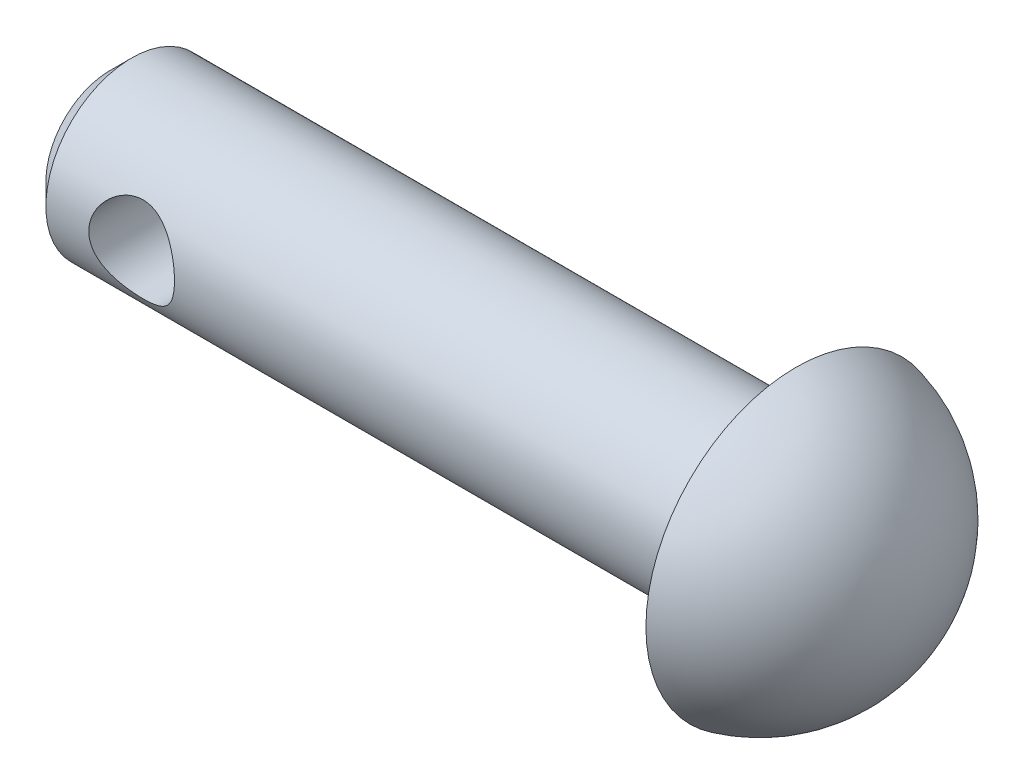
ISO-10303-21;
HEADER;
FILE_DESCRIPTION(('STEP AP214'),'2;1');
FILE_NAME('part.step','',(''),(''),'','','');
FILE_SCHEMA(('AUTOMOTIVE_DESIGN { 1 0 10303 214 1 1 1 1 }'));
ENDSEC;
DATA;
#1=APPLICATION_CONTEXT('core data for automotive mechanical design processes');
#2=APPLICATION_PROTOCOL_DEFINITION('international standard','automotive_design',2000,#1);
#3=PRODUCT_CONTEXT('',#1,'mechanical');
#4=PRODUCT('Part','Part','',(#3));
#5=PRODUCT_RELATED_PRODUCT_CATEGORY('part','',(#4));
#6=PRODUCT_DEFINITION_FORMATION('','',#4);
#7=PRODUCT_DEFINITION_CONTEXT('part definition',#1,'design');
#8=PRODUCT_DEFINITION('design','',#6,#7);
#9=PRODUCT_DEFINITION_SHAPE('','',#8);
#10=(LENGTH_UNIT() NAMED_UNIT(*) SI_UNIT(.MILLI.,.METRE.));
#11=(NAMED_UNIT(*) PLANE_ANGLE_UNIT() SI_UNIT($,.RADIAN.));
#12=(NAMED_UNIT(*) SI_UNIT($,.STERADIAN.) SOLID_ANGLE_UNIT());
#13=UNCERTAINTY_MEASURE_WITH_UNIT(LENGTH_MEASURE(1.E-05),#10,'distance_accuracy_value','');
#14=(GEOMETRIC_REPRESENTATION_CONTEXT(3) GLOBAL_UNCERTAINTY_ASSIGNED_CONTEXT((#13)) GLOBAL_UNIT_ASSIGNED_CONTEXT((#10,
#11,#12)) REPRESENTATION_CONTEXT('',''));
#15=CARTESIAN_POINT('',(0.,0.,0.));
#16=DIRECTION('',(0.,0.,1.));
#17=DIRECTION('',(1.,0.,0.));
#18=AXIS2_PLACEMENT_3D('',#15,#16,#17);
#19=CARTESIAN_POINT('',(-16.,0.,0.));
#20=DIRECTION('',(1.,0.,0.));
#21=DIRECTION('',(0.,0.,-1.));
#22=AXIS2_PLACEMENT_3D('',#19,#20,#21);
#23=CYLINDRICAL_SURFACE('',#22,2.);
#24=CARTESIAN_POINT('',(-15.5,0.,0.));
#25=DIRECTION('',(1.,0.,0.));
#26=DIRECTION('',(0.,0.,-1.));
#27=AXIS2_PLACEMENT_3D('',#24,#25,#26);
#28=CIRCLE('',#27,2.);
#29=CARTESIAN_POINT('',(-15.5,0.,-2.));
#30=VERTEX_POINT('',#29);
#31=EDGE_CURVE('E38',#30,#30,#28,.T.);
#32=ORIENTED_EDGE('',*,*,#31,.T.);
#33=EDGE_LOOP('',(#32));
#34=FACE_BOUND('',#33,.T.);
#35=CARTESIAN_POINT('',(-14.5,0.,-2.));
#36=CARTESIAN_POINT('',(-14.4999966976805,0.0525719629529866,-1.99999713404151));
#37=CARTESIAN_POINT('',(-14.4958299268783,0.105206599698033,-1.99790491019518));
#38=CARTESIAN_POINT('',(-14.4793471196591,0.208920235268425,-1.98974156037396));
#39=CARTESIAN_POINT('',(-14.4670156070024,0.259996086713504,-1.98366287828984));
#40=CARTESIAN_POINT('',(-14.4348061913832,0.358933544880575,-1.96816279403312));
#41=CARTESIAN_POINT('',(-14.414957615752,0.40680680293918,-1.9587543917752));
#42=CARTESIAN_POINT('',(-14.3684293786351,0.498472616806565,-1.93745776515779));
#43=CARTESIAN_POINT('',(-14.3417502557511,0.54226549399005,-1.9255697363353));
#44=CARTESIAN_POINT('',(-14.2804827505147,0.62750781776192,-1.89956258258057));
#45=CARTESIAN_POINT('',(-14.2455135207604,0.668655211122113,-1.88535199127536));
#46=CARTESIAN_POINT('',(-14.169478520753,0.744779444866978,-1.85659970246744));
#47=CARTESIAN_POINT('',(-14.1284081482276,0.779751583106767,-1.84205776209035));
#48=CARTESIAN_POINT('',(-14.0375166504766,0.845252000450279,-1.81298951197347));
#49=CARTESIAN_POINT('',(-13.9872639016541,0.875225335551638,-1.79855186970132));
#50=CARTESIAN_POINT('',(-13.8816326640138,0.926168226890696,-1.7728597877232));
#51=CARTESIAN_POINT('',(-13.8262578712773,0.947144214966335,-1.7616030760699));
#52=CARTESIAN_POINT('',(-13.7153348945781,0.97813244218859,-1.74457867037808));
#53=CARTESIAN_POINT('',(-13.6599955479326,0.988725857080443,-1.73852271583713));
#54=CARTESIAN_POINT('',(-13.5480211622205,1.00042699330885,-1.73181889948528));
#55=CARTESIAN_POINT('',(-13.4913874591288,1.00154408837308,-1.73116569343288));
#56=CARTESIAN_POINT('',(-13.3857139756846,0.994687287172296,-1.73510930257248));
#57=CARTESIAN_POINT('',(-13.336575968777,0.987784559536823,-1.73908763662013));
#58=CARTESIAN_POINT('',(-13.240278090627,0.966939849056934,-1.7507622873385));
#59=CARTESIAN_POINT('',(-13.1931188546947,0.952995623897653,-1.75845978831776));
#60=CARTESIAN_POINT('',(-13.1007708674343,0.918209780386005,-1.77687476412741));
#61=CARTESIAN_POINT('',(-13.0556536012142,0.897215067115995,-1.78765840663999));
#62=CARTESIAN_POINT('',(-12.96936570741,0.849041687668003,-1.81103404281404));
#63=CARTESIAN_POINT('',(-12.9281968643999,0.821860243812468,-1.82362684780191));
#64=CARTESIAN_POINT('',(-12.8454787472568,0.75806605491279,-1.85113157903286));
#65=CARTESIAN_POINT('',(-12.8045431264238,0.720694458369282,-1.86613510236746));
#66=CARTESIAN_POINT('',(-12.7292645814091,0.639555578741375,-1.89547623300407));
#67=CARTESIAN_POINT('',(-12.6949248079661,0.595785256574287,-1.90981351958801));
#68=CARTESIAN_POINT('',(-12.6323143389703,0.50051650583185,-1.93701987282964));
#69=CARTESIAN_POINT('',(-12.6043995275543,0.44875359159941,-1.94978984162007));
#70=CARTESIAN_POINT('',(-12.557902970957,0.340466215488798,-1.97157881121242));
#71=CARTESIAN_POINT('',(-12.5393138149848,0.283945576265278,-1.98060078943553));
#72=CARTESIAN_POINT('',(-12.5135245962833,0.172766491660703,-1.99324333741436));
#73=CARTESIAN_POINT('',(-12.5055087642532,0.118341530548325,-1.99724938301312));
#74=CARTESIAN_POINT('',(-12.4985352688655,0.00877959994935463,-2.00073013459102));
#75=CARTESIAN_POINT('',(-12.4995733143605,-0.0463570198699006,-2.00020698721312));
#76=CARTESIAN_POINT('',(-12.5102066884188,-0.151232971985993,-1.99491192253441));
#77=CARTESIAN_POINT('',(-12.51913253273,-0.201059408049954,-1.9904724568819));
#78=CARTESIAN_POINT('',(-12.5442380718951,-0.298406892301917,-1.97822171314819));
#79=CARTESIAN_POINT('',(-12.5604185664534,-0.345927685690997,-1.97041006334332));
#80=CARTESIAN_POINT('',(-12.5999984664332,-0.438888608449665,-1.95184251413669));
#81=CARTESIAN_POINT('',(-12.6235910501168,-0.484230397006154,-1.94100881769939));
#82=CARTESIAN_POINT('',(-12.677107535646,-0.570461361698921,-1.91743974317109));
#83=CARTESIAN_POINT('',(-12.7070341345934,-0.611348629775282,-1.90470355565785));
#84=CARTESIAN_POINT('',(-12.7757604253329,-0.691767689290653,-1.87708221337464));
#85=CARTESIAN_POINT('',(-12.8151428684536,-0.730772077824639,-1.86210884848441));
#86=CARTESIAN_POINT('',(-12.8999251512693,-0.80185632111324,-1.83262391603874));
#87=CARTESIAN_POINT('',(-12.9453291188164,-0.833931385690841,-1.81811267381526));
#88=CARTESIAN_POINT('',(-13.0436436542003,-0.891707914497696,-1.79051192226068));
#89=CARTESIAN_POINT('',(-13.0968112662086,-0.917025495878638,-1.77752529663472));
#90=CARTESIAN_POINT('',(-13.2075100676925,-0.958082826013804,-1.75574072368126));
#91=CARTESIAN_POINT('',(-13.2650355265012,-0.973834915887571,-1.74693738240618));
#92=CARTESIAN_POINT('',(-13.3769102228614,-0.993861687449681,-1.73561501008667));
#93=CARTESIAN_POINT('',(-13.431034253429,-0.999092996400866,-1.73257383460491));
#94=CARTESIAN_POINT('',(-13.5394470671707,-1.00068915438079,-1.73165354646175));
#95=CARTESIAN_POINT('',(-13.5937357687394,-0.9970578466244,-1.73377219627553));
#96=CARTESIAN_POINT('',(-13.695483501532,-0.981926125592265,-1.74237862050025));
#97=CARTESIAN_POINT('',(-13.7431004701444,-0.971208314342801,-1.74843094482393));
#98=CARTESIAN_POINT('',(-13.8358081194247,-0.943175358224647,-1.76371016187917));
#99=CARTESIAN_POINT('',(-13.880897982092,-0.925858091159812,-1.77293807569675));
#100=CARTESIAN_POINT('',(-13.9706248509866,-0.883815745300685,-1.79428530364528));
#101=CARTESIAN_POINT('',(-14.0150279018297,-0.85867113781646,-1.8065572239619));
#102=CARTESIAN_POINT('',(-14.0992745361806,-0.802150971636637,-1.8323533163459));
#103=CARTESIAN_POINT('',(-14.1391157305185,-0.77077217123865,-1.84587813794522));
#104=CARTESIAN_POINT('',(-14.2181419823576,-0.698203326664643,-1.87462323159313));
#105=CARTESIAN_POINT('',(-14.2566591023619,-0.656284423010173,-1.88984983311469));
#106=CARTESIAN_POINT('',(-14.3262629834236,-0.56615480622028,-1.91877752255088));
#107=CARTESIAN_POINT('',(-14.3573457394263,-0.517940723256786,-1.9324777860804));
#108=CARTESIAN_POINT('',(-14.4112363627622,-0.415931596819948,-1.95698009585103));
#109=CARTESIAN_POINT('',(-14.4339841694114,-0.362099503934615,-1.96776096562909));
#110=CARTESIAN_POINT('',(-14.469808167919,-0.250742101294192,-1.98501341363465));
#111=CARTESIAN_POINT('',(-14.4829118468296,-0.193227799623167,-1.99149723372932));
#112=CARTESIAN_POINT('',(-14.4938974110759,-0.112601946483385,-1.99695461909663));
#113=CARTESIAN_POINT('',(-14.4961826408636,-0.0901618794394997,-1.99809365339202));
#114=CARTESIAN_POINT('',(-14.4992346655168,-0.0451517318071583,-1.99961696977865));
#115=CARTESIAN_POINT('',(-14.5000014184712,-0.0225816476473817,-2.00000123103763));
#116=CARTESIAN_POINT('',(-14.5,0.,-2.));
#117=B_SPLINE_CURVE_WITH_KNOTS('',3,(#35,#36,#37,#38,#39,#40,#41,#42,#43,#44,#45,#46,#47,#48,
#49,#50,#51,#52,#53,#54,#55,#56,#57,#58,#59,#60,#61,#62,#63,#64,#65,#66,#67,#68,#69,#70,#71,#72,
#73,#74,#75,#76,#77,#78,#79,#80,#81,#82,#83,#84,#85,#86,#87,#88,#89,#90,#91,#92,#93,#94,#95,#96,
#97,#98,#99,#100,#101,#102,#103,#104,#105,#106,#107,#108,#109,#110,#111,#112,#113,#114,#115,
#116),.UNSPECIFIED.,.T.,.F.,(4,2,2,2,2,2,2,2,2,2,2,2,2,2,2,2,2,2,2,2,2,2,2,2,2,2,2,2,2,2,2,2,2,
2,2,2,2,2,2,2,4),(0.,0.157624257420293,0.315548149709198,0.472862155492298,0.630163760581568,
0.79698175871809,0.963926237654036,1.14381726430753,1.32357947898281,1.4925801214023,
1.66141357329021,1.81005712409321,1.95874803925679,2.11090240168488,2.26312521260222,
2.43464941333879,2.60625534598687,2.78583022214441,2.9652621691228,3.12983290471346,
3.29432564511476,3.44606906506122,3.59782921630932,3.75392856027899,3.9100945074834,
4.08159610644419,4.25321588615432,4.43314682159674,4.61284511940778,4.77529307498374,
4.93767059860006,5.08457930244183,5.23153528783679,5.38836456775615,5.54527561138958,
5.72125242752499,5.89732383376573,6.07464013662926,6.25144908624931,6.31915280137699,
6.38685838514848),.UNSPECIFIED.);
#118=CARTESIAN_POINT('',(-14.5,0.,-2.));
#119=VERTEX_POINT('',#118);
#120=EDGE_CURVE('E46',#119,#119,#117,.T.);
#121=ORIENTED_EDGE('',*,*,#120,.F.);
#122=EDGE_LOOP('',(#121));
#123=FACE_BOUND('',#122,.T.);
#124=CARTESIAN_POINT('',(-12.5,0.,2.));
#125=CARTESIAN_POINT('',(-12.5000033023195,0.0525719629529866,1.99999713404151));
#126=CARTESIAN_POINT('',(-12.5041700731217,0.105206599698033,1.99790491019518));
#127=CARTESIAN_POINT('',(-12.5206528803409,0.208920235268425,1.98974156037396));
#128=CARTESIAN_POINT('',(-12.5329843929976,0.259996086713504,1.98366287828984));
#129=CARTESIAN_POINT('',(-12.5651938086168,0.358933544880575,1.96816279403312));
#130=CARTESIAN_POINT('',(-12.585042384248,0.40680680293918,1.9587543917752));
#131=CARTESIAN_POINT('',(-12.6315706213649,0.498472616806565,1.93745776515779));
#132=CARTESIAN_POINT('',(-12.6582497442489,0.54226549399005,1.9255697363353));
#133=CARTESIAN_POINT('',(-12.7195172494853,0.627507817761919,1.89956258258057));
#134=CARTESIAN_POINT('',(-12.7544864792396,0.668655211122112,1.88535199127536));
#135=CARTESIAN_POINT('',(-12.830521479247,0.744779444866978,1.85659970246744));
#136=CARTESIAN_POINT('',(-12.8715918517724,0.779751583106767,1.84205776209035));
#137=CARTESIAN_POINT('',(-12.9624833495234,0.845252000450279,1.81298951197347));
#138=CARTESIAN_POINT('',(-13.0127360983459,0.875225335551638,1.79855186970132));
#139=CARTESIAN_POINT('',(-13.1183673359862,0.926168226890696,1.77285978772321));
#140=CARTESIAN_POINT('',(-13.1737421287227,0.947144214966335,1.7616030760699));
#141=CARTESIAN_POINT('',(-13.2846651054219,0.97813244218859,1.74457867037808));
#142=CARTESIAN_POINT('',(-13.3400044520674,0.988725857080443,1.73852271583713));
#143=CARTESIAN_POINT('',(-13.4519788377795,1.00042699330885,1.73181889948528));
#144=CARTESIAN_POINT('',(-13.5086125408712,1.00154408837308,1.73116569343288));
#145=CARTESIAN_POINT('',(-13.6142860243154,0.994687287172296,1.73510930257248));
#146=CARTESIAN_POINT('',(-13.6634240312231,0.987784559536823,1.73908763662013));
#147=CARTESIAN_POINT('',(-13.759721909373,0.966939849056933,1.7507622873385));
#148=CARTESIAN_POINT('',(-13.8068811453053,0.952995623897653,1.75845978831776));
#149=CARTESIAN_POINT('',(-13.8992291325657,0.918209780386005,1.77687476412741));
#150=CARTESIAN_POINT('',(-13.9443463987858,0.897215067115997,1.78765840663998));
#151=CARTESIAN_POINT('',(-14.03063429259,0.849041687668004,1.81103404281404));
#152=CARTESIAN_POINT('',(-14.0718031356001,0.821860243812469,1.8236268478019));
#153=CARTESIAN_POINT('',(-14.1545212527432,0.75806605491279,1.85113157903286));
#154=CARTESIAN_POINT('',(-14.1954568735762,0.720694458369283,1.86613510236746));
#155=CARTESIAN_POINT('',(-14.2707354185909,0.639555578741375,1.89547623300407));
#156=CARTESIAN_POINT('',(-14.3050751920339,0.595785256574287,1.90981351958801));
#157=CARTESIAN_POINT('',(-14.3676856610297,0.500516505831851,1.93701987282964));
#158=CARTESIAN_POINT('',(-14.3956004724457,0.448753591599411,1.94978984162007));
#159=CARTESIAN_POINT('',(-14.442097029043,0.340466215488799,1.97157881121242));
#160=CARTESIAN_POINT('',(-14.4606861850152,0.283945576265278,1.98060078943553));
#161=CARTESIAN_POINT('',(-14.4864754037167,0.172766491660703,1.99324333741436));
#162=CARTESIAN_POINT('',(-14.4944912357468,0.118341530548325,1.99724938301312));
#163=CARTESIAN_POINT('',(-14.5014647311345,0.00877959994935461,2.00073013459102));
#164=CARTESIAN_POINT('',(-14.5004266856395,-0.0463570198699006,2.00020698721312));
#165=CARTESIAN_POINT('',(-14.4897933115812,-0.151232971985993,1.99491192253441));
#166=CARTESIAN_POINT('',(-14.48086746727,-0.201059408049954,1.9904724568819));
#167=CARTESIAN_POINT('',(-14.4557619281049,-0.298406892301917,1.97822171314819));
#168=CARTESIAN_POINT('',(-14.4395814335466,-0.345927685690997,1.97041006334332));
#169=CARTESIAN_POINT('',(-14.4000015335668,-0.438888608449665,1.95184251413669));
#170=CARTESIAN_POINT('',(-14.3764089498832,-0.484230397006154,1.94100881769939));
#171=CARTESIAN_POINT('',(-14.322892464354,-0.570461361698921,1.91743974317109));
#172=CARTESIAN_POINT('',(-14.2929658654066,-0.611348629775282,1.90470355565785));
#173=CARTESIAN_POINT('',(-14.2242395746671,-0.691767689290653,1.87708221337464));
#174=CARTESIAN_POINT('',(-14.1848571315464,-0.730772077824639,1.86210884848441));
#175=CARTESIAN_POINT('',(-14.1000748487307,-0.80185632111324,1.83262391603874));
#176=CARTESIAN_POINT('',(-14.0546708811836,-0.833931385690841,1.81811267381526));
#177=CARTESIAN_POINT('',(-13.9563563457997,-0.891707914497696,1.79051192226068));
#178=CARTESIAN_POINT('',(-13.9031887337914,-0.917025495878637,1.77752529663472));
#179=CARTESIAN_POINT('',(-13.7924899323075,-0.958082826013803,1.75574072368126));
#180=CARTESIAN_POINT('',(-13.7349644734988,-0.973834915887571,1.74693738240618));
#181=CARTESIAN_POINT('',(-13.6230897771386,-0.993861687449681,1.73561501008667));
#182=CARTESIAN_POINT('',(-13.568965746571,-0.999092996400866,1.73257383460491));
#183=CARTESIAN_POINT('',(-13.4605529328293,-1.00068915438079,1.73165354646175));
#184=CARTESIAN_POINT('',(-13.4062642312606,-0.9970578466244,1.73377219627553));
#185=CARTESIAN_POINT('',(-13.304516498468,-0.981926125592265,1.74237862050025));
#186=CARTESIAN_POINT('',(-13.2568995298556,-0.971208314342801,1.74843094482393));
#187=CARTESIAN_POINT('',(-13.1641918805753,-0.943175358224647,1.76371016187917));
#188=CARTESIAN_POINT('',(-13.119102017908,-0.925858091159812,1.77293807569676));
#189=CARTESIAN_POINT('',(-13.0293751490134,-0.883815745300684,1.79428530364528));
#190=CARTESIAN_POINT('',(-12.9849720981703,-0.858671137816459,1.80655722396191));
#191=CARTESIAN_POINT('',(-12.9007254638194,-0.802150971636636,1.8323533163459));
#192=CARTESIAN_POINT('',(-12.8608842694815,-0.77077217123865,1.84587813794522));
#193=CARTESIAN_POINT('',(-12.7818580176424,-0.698203326664643,1.87462323159313));
#194=CARTESIAN_POINT('',(-12.7433408976381,-0.656284423010172,1.88984983311469));
#195=CARTESIAN_POINT('',(-12.6737370165764,-0.566154806220281,1.91877752255088));
#196=CARTESIAN_POINT('',(-12.6426542605737,-0.517940723256786,1.9324777860804));
#197=CARTESIAN_POINT('',(-12.5887636372378,-0.415931596819948,1.95698009585103));
#198=CARTESIAN_POINT('',(-12.5660158305886,-0.362099503934616,1.96776096562909));
#199=CARTESIAN_POINT('',(-12.530191832081,-0.250742101294192,1.98501341363465));
#200=CARTESIAN_POINT('',(-12.5170881531704,-0.193227799623167,1.99149723372932));
#201=CARTESIAN_POINT('',(-12.5061025889241,-0.112601946483385,1.99695461909663));
#202=CARTESIAN_POINT('',(-12.5038173591364,-0.0901618794394997,1.99809365339202));
#203=CARTESIAN_POINT('',(-12.5007653344832,-0.0451517318071583,1.99961696977865));
#204=CARTESIAN_POINT('',(-12.4999985815288,-0.0225816476473817,2.00000123103763));
#205=CARTESIAN_POINT('',(-12.5,0.,2.));
#206=B_SPLINE_CURVE_WITH_KNOTS('',3,(#124,#125,#126,#127,#128,#129,#130,#131,#132,#133,#134,
#135,#136,#137,#138,#139,#140,#141,#142,#143,#144,#145,#146,#147,#148,#149,#150,#151,#152,#153,
#154,#155,#156,#157,#158,#159,#160,#161,#162,#163,#164,#165,#166,#167,#168,#169,#170,#171,#172,
#173,#174,#175,#176,#177,#178,#179,#180,#181,#182,#183,#184,#185,#186,#187,#188,#189,#190,#191,
#192,#193,#194,#195,#196,#197,#198,#199,#200,#201,#202,#203,#204,#205),.UNSPECIFIED.,.T.,.F.,(4,
2,2,2,2,2,2,2,2,2,2,2,2,2,2,2,2,2,2,2,2,2,2,2,2,2,2,2,2,2,2,2,2,2,2,2,2,2,2,2,4),(0.,
0.157624257420293,0.315548149709198,0.472862155492298,0.630163760581568,0.796981758718089,
0.963926237654036,1.14381726430753,1.32357947898281,1.4925801214023,1.66141357329021,
1.81005712409321,1.95874803925679,2.11090240168487,2.26312521260222,2.43464941333879,
2.60625534598687,2.78583022214441,2.9652621691228,3.12983290471346,3.29432564511476,
3.44606906506122,3.59782921630932,3.75392856027899,3.9100945074834,4.08159610644419,
4.25321588615432,4.43314682159674,4.61284511940778,4.77529307498374,4.93767059860006,
5.08457930244183,5.23153528783679,5.38836456775615,5.54527561138958,5.72125242752499,
5.89732383376573,6.07464013662926,6.25144908624931,6.31915280137698,6.38685838514848),.UNSPECIFIED.);
#207=CARTESIAN_POINT('',(-12.5,0.,2.));
#208=VERTEX_POINT('',#207);
#209=EDGE_CURVE('E54',#208,#208,#206,.T.);
#210=ORIENTED_EDGE('',*,*,#209,.F.);
#211=EDGE_LOOP('',(#210));
#212=FACE_BOUND('',#211,.T.);
#213=CARTESIAN_POINT('',(0.,0.,0.));
#214=DIRECTION('',(1.,0.,0.));
#215=DIRECTION('',(0.,0.,-1.));
#216=AXIS2_PLACEMENT_3D('',#213,#214,#215);
#217=CIRCLE('',#216,2.);
#218=CARTESIAN_POINT('',(0.,0.,-2.));
#219=VERTEX_POINT('',#218);
#220=EDGE_CURVE('E42',#219,#219,#217,.T.);
#221=ORIENTED_EDGE('',*,*,#220,.F.);
#222=EDGE_LOOP('',(#221));
#223=FACE_BOUND('',#222,.T.);
#224=ADVANCED_FACE('F31',(#34,#123,#212,#223),#23,.T.);
#225=CARTESIAN_POINT('',(-16.,0.,0.));
#226=DIRECTION('',(1.,0.,0.));
#227=DIRECTION('',(0.,0.,-1.));
#228=AXIS2_PLACEMENT_3D('',#225,#226,#227);
#229=PLANE('',#228);
#230=CARTESIAN_POINT('',(-16.,0.,0.));
#231=DIRECTION('',(1.,0.,0.));
#232=DIRECTION('',(0.,0.,-1.));
#233=AXIS2_PLACEMENT_3D('',#230,#231,#232);
#234=CIRCLE('',#233,1.5);
#235=CARTESIAN_POINT('',(-16.,0.,-1.5));
#236=VERTEX_POINT('',#235);
#237=EDGE_CURVE('E10',#236,#236,#234,.F.);
#238=ORIENTED_EDGE('',*,*,#237,.T.);
#239=EDGE_LOOP('',(#238));
#240=FACE_BOUND('',#239,.T.);
#241=ADVANCED_FACE('F64',(#240),#229,.F.);
#242=CARTESIAN_POINT('',(-13.5,0.,-8.));
#243=DIRECTION('',(0.,0.,1.));
#244=DIRECTION('',(1.,0.,0.));
#245=AXIS2_PLACEMENT_3D('',#242,#243,#244);
#246=CYLINDRICAL_SURFACE('',#245,1.);
#247=ORIENTED_EDGE('',*,*,#120,.T.);
#248=EDGE_LOOP('',(#247));
#249=FACE_BOUND('',#248,.T.);
#250=ORIENTED_EDGE('',*,*,#209,.T.);
#251=EDGE_LOOP('',(#250));
#252=FACE_BOUND('',#251,.T.);
#253=ADVANCED_FACE('F59',(#249,#252),#246,.F.);
#254=CARTESIAN_POINT('',(-0.842614977317635,0.,0.));
#255=DIRECTION('',(-1.,0.,0.));
#256=DIRECTION('',(0.,0.,-1.));
#257=AXIS2_PLACEMENT_3D('',#254,#255,#256);
#258=SPHERICAL_SURFACE('',#257,3.6);
#259=CARTESIAN_POINT('',(0.,0.,0.));
#260=DIRECTION('',(-1.,0.,0.));
#261=DIRECTION('',(0.,0.,1.));
#262=AXIS2_PLACEMENT_3D('',#259,#260,#261);
#263=CIRCLE('',#262,3.5);
#264=CARTESIAN_POINT('',(0.,0.,3.5));
#265=VERTEX_POINT('',#264);
#266=EDGE_CURVE('E87',#265,#265,#263,.T.);
#267=ORIENTED_EDGE('',*,*,#266,.F.);
#268=EDGE_LOOP('',(#267));
#269=FACE_BOUND('',#268,.T.);
#270=ADVANCED_FACE('F63',(#269),#258,.T.);
#271=CARTESIAN_POINT('',(0.,0.,-3.5));
#272=DIRECTION('',(1.,0.,0.));
#273=DIRECTION('',(0.,0.,-1.));
#274=AXIS2_PLACEMENT_3D('',#271,#272,#273);
#275=PLANE('',#274);
#276=ORIENTED_EDGE('',*,*,#220,.T.);
#277=EDGE_LOOP('',(#276));
#278=FACE_BOUND('',#277,.T.);
#279=ORIENTED_EDGE('',*,*,#266,.T.);
#280=EDGE_LOOP('',(#279));
#281=FACE_BOUND('',#280,.T.);
#282=ADVANCED_FACE('F82',(#278,#281),#275,.F.);
#283=CARTESIAN_POINT('',(-15.5,0.,0.));
#284=DIRECTION('',(1.,0.,0.));
#285=DIRECTION('',(0.,0.,-1.));
#286=AXIS2_PLACEMENT_3D('',#283,#284,#285);
#287=CONICAL_SURFACE('',#286,2.,0.785398163397452);
#288=ORIENTED_EDGE('',*,*,#237,.F.);
#289=EDGE_LOOP('',(#288));
#290=FACE_BOUND('',#289,.T.);
#291=ORIENTED_EDGE('',*,*,#31,.F.);
#292=EDGE_LOOP('',(#291));
#293=FACE_BOUND('',#292,.T.);
#294=ADVANCED_FACE('F33',(#290,#293),#287,.T.);
#295=CLOSED_SHELL('',(#224,#241,#253,#270,#282,#294));
#296=MANIFOLD_SOLID_BREP('B2',#295);
#297=ADVANCED_BREP_SHAPE_REPRESENTATION('',(#18,#296),#14);
#298=SHAPE_DEFINITION_REPRESENTATION(#9,#297);
ENDSEC;
END-ISO-10303-21;
